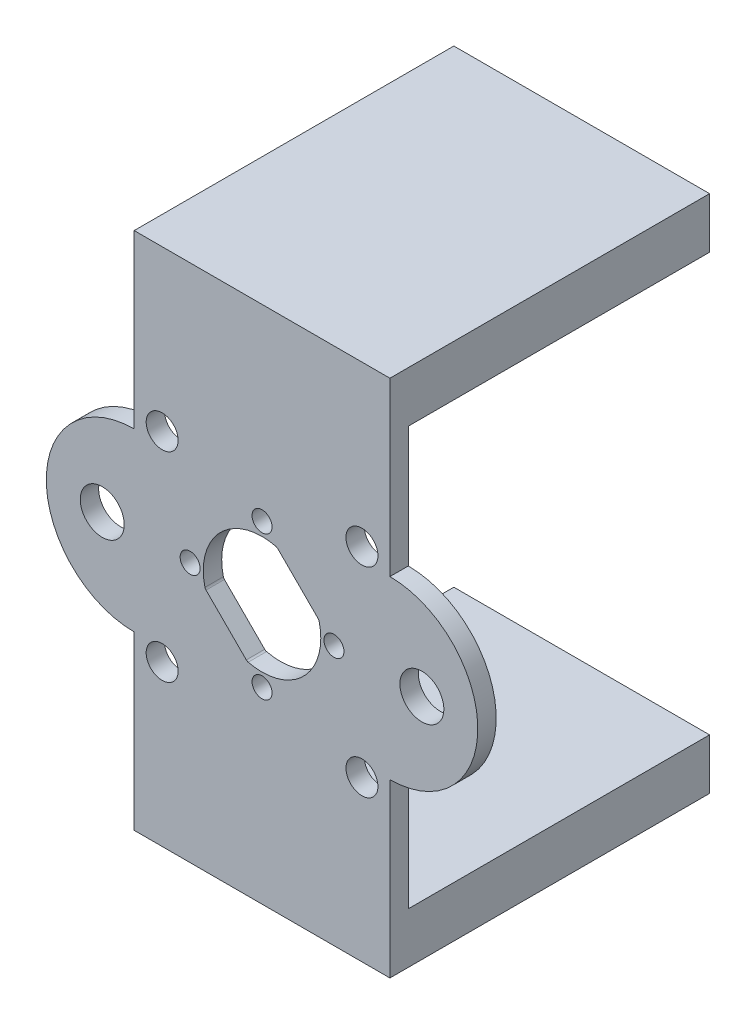
ISO-10303-21;
HEADER;
FILE_DESCRIPTION(('STEP AP214'),'2;1');
FILE_NAME('part.step','',(''),(''),'','','');
FILE_SCHEMA(('AUTOMOTIVE_DESIGN { 1 0 10303 214 1 1 1 1 }'));
ENDSEC;
DATA;
#1=APPLICATION_CONTEXT('core data for automotive mechanical design processes');
#2=APPLICATION_PROTOCOL_DEFINITION('international standard','automotive_design',2000,#1);
#3=PRODUCT_CONTEXT('',#1,'mechanical');
#4=PRODUCT('Part','Part','',(#3));
#5=PRODUCT_RELATED_PRODUCT_CATEGORY('part','',(#4));
#6=PRODUCT_DEFINITION_FORMATION('','',#4);
#7=PRODUCT_DEFINITION_CONTEXT('part definition',#1,'design');
#8=PRODUCT_DEFINITION('design','',#6,#7);
#9=PRODUCT_DEFINITION_SHAPE('','',#8);
#10=(LENGTH_UNIT() NAMED_UNIT(*) SI_UNIT(.MILLI.,.METRE.));
#11=(NAMED_UNIT(*) PLANE_ANGLE_UNIT() SI_UNIT($,.RADIAN.));
#12=(NAMED_UNIT(*) SI_UNIT($,.STERADIAN.) SOLID_ANGLE_UNIT());
#13=UNCERTAINTY_MEASURE_WITH_UNIT(LENGTH_MEASURE(1.E-05),#10,'distance_accuracy_value','');
#14=(GEOMETRIC_REPRESENTATION_CONTEXT(3) GLOBAL_UNCERTAINTY_ASSIGNED_CONTEXT((#13)) GLOBAL_UNIT_ASSIGNED_CONTEXT((#10,
#11,#12)) REPRESENTATION_CONTEXT('',''));
#15=CARTESIAN_POINT('',(0.,0.,0.));
#16=DIRECTION('',(0.,0.,1.));
#17=DIRECTION('',(1.,0.,0.));
#18=AXIS2_PLACEMENT_3D('',#15,#16,#17);
#19=CARTESIAN_POINT('',(16.,-32.5,-40.));
#20=DIRECTION('',(1.,0.,0.));
#21=DIRECTION('',(0.,0.,-1.));
#22=AXIS2_PLACEMENT_3D('',#19,#20,#21);
#23=PLANE('',#22);
#24=DIRECTION('',(0.,0.,1.));
#25=VECTOR('',#24,1.);
#26=CARTESIAN_POINT('',(16.,32.5,-40.));
#27=LINE('',#26,#25);
#28=CARTESIAN_POINT('',(16.,32.5,-40.));
#29=VERTEX_POINT('',#28);
#30=CARTESIAN_POINT('',(16.,32.5,0.));
#31=VERTEX_POINT('',#30);
#32=EDGE_CURVE('E48',#29,#31,#27,.T.);
#33=ORIENTED_EDGE('',*,*,#32,.T.);
#34=DIRECTION('',(0.,1.,0.));
#35=VECTOR('',#34,1.);
#36=CARTESIAN_POINT('',(16.,-32.5,0.));
#37=LINE('',#36,#35);
#38=CARTESIAN_POINT('',(16.,11.,0.));
#39=VERTEX_POINT('',#38);
#40=EDGE_CURVE('E346',#39,#31,#37,.T.);
#41=ORIENTED_EDGE('',*,*,#40,.F.);
#42=DIRECTION('',(0.,0.,1.));
#43=VECTOR('',#42,1.);
#44=CARTESIAN_POINT('',(16.,11.,-2.3));
#45=LINE('',#44,#43);
#46=CARTESIAN_POINT('',(16.,11.,-2.3));
#47=VERTEX_POINT('',#46);
#48=EDGE_CURVE('E313',#47,#39,#45,.T.);
#49=ORIENTED_EDGE('',*,*,#48,.F.);
#50=DIRECTION('',(0.,-1.,0.));
#51=VECTOR('',#50,1.);
#52=CARTESIAN_POINT('',(16.,-26.15,-2.3));
#53=LINE('',#52,#51);
#54=CARTESIAN_POINT('',(16.,26.15,-2.3));
#55=VERTEX_POINT('',#54);
#56=EDGE_CURVE('E333',#55,#47,#53,.T.);
#57=ORIENTED_EDGE('',*,*,#56,.F.);
#58=DIRECTION('',(0.,0.,-1.));
#59=VECTOR('',#58,1.);
#60=CARTESIAN_POINT('',(16.,26.15,-2.3));
#61=LINE('',#60,#59);
#62=CARTESIAN_POINT('',(16.,26.15,-40.));
#63=VERTEX_POINT('',#62);
#64=EDGE_CURVE('E349',#55,#63,#61,.T.);
#65=ORIENTED_EDGE('',*,*,#64,.T.);
#66=DIRECTION('',(0.,1.,0.));
#67=VECTOR('',#66,1.);
#68=CARTESIAN_POINT('',(16.,-32.5,-40.));
#69=LINE('',#68,#67);
#70=EDGE_CURVE('E357',#63,#29,#69,.T.);
#71=ORIENTED_EDGE('',*,*,#70,.T.);
#72=EDGE_LOOP('',(#33,#41,#49,#57,#65,#71));
#73=FACE_BOUND('',#72,.T.);
#74=ADVANCED_FACE('F44',(#73),#23,.T.);
#75=CARTESIAN_POINT('',(-16.,-32.5,-40.));
#76=DIRECTION('',(-1.,0.,0.));
#77=DIRECTION('',(0.,0.,1.));
#78=AXIS2_PLACEMENT_3D('',#75,#76,#77);
#79=PLANE('',#78);
#80=DIRECTION('',(0.,0.,1.));
#81=VECTOR('',#80,1.);
#82=CARTESIAN_POINT('',(-16.,-32.5,-40.));
#83=LINE('',#82,#81);
#84=CARTESIAN_POINT('',(-16.,-32.5,-40.));
#85=VERTEX_POINT('',#84);
#86=CARTESIAN_POINT('',(-16.,-32.5,0.));
#87=VERTEX_POINT('',#86);
#88=EDGE_CURVE('E53',#85,#87,#83,.T.);
#89=ORIENTED_EDGE('',*,*,#88,.T.);
#90=DIRECTION('',(0.,-1.,0.));
#91=VECTOR('',#90,1.);
#92=CARTESIAN_POINT('',(-16.,-32.5,0.));
#93=LINE('',#92,#91);
#94=CARTESIAN_POINT('',(-16.,-11.,0.));
#95=VERTEX_POINT('',#94);
#96=EDGE_CURVE('E373',#95,#87,#93,.T.);
#97=ORIENTED_EDGE('',*,*,#96,.F.);
#98=DIRECTION('',(0.,0.,1.));
#99=VECTOR('',#98,1.);
#100=CARTESIAN_POINT('',(-16.,-11.,-2.3));
#101=LINE('',#100,#99);
#102=CARTESIAN_POINT('',(-16.,-11.,-2.3));
#103=VERTEX_POINT('',#102);
#104=EDGE_CURVE('E320',#103,#95,#101,.T.);
#105=ORIENTED_EDGE('',*,*,#104,.F.);
#106=DIRECTION('',(0.,1.,0.));
#107=VECTOR('',#106,1.);
#108=CARTESIAN_POINT('',(-16.,-26.15,-2.3));
#109=LINE('',#108,#107);
#110=CARTESIAN_POINT('',(-16.,-26.15,-2.3));
#111=VERTEX_POINT('',#110);
#112=EDGE_CURVE('E325',#111,#103,#109,.T.);
#113=ORIENTED_EDGE('',*,*,#112,.F.);
#114=DIRECTION('',(0.,0.,-1.));
#115=VECTOR('',#114,1.);
#116=CARTESIAN_POINT('',(-16.,-26.15,-2.3));
#117=LINE('',#116,#115);
#118=CARTESIAN_POINT('',(-16.,-26.15,-40.));
#119=VERTEX_POINT('',#118);
#120=EDGE_CURVE('E343',#111,#119,#117,.T.);
#121=ORIENTED_EDGE('',*,*,#120,.T.);
#122=DIRECTION('',(0.,-1.,0.));
#123=VECTOR('',#122,1.);
#124=CARTESIAN_POINT('',(-16.,-32.5,-40.));
#125=LINE('',#124,#123);
#126=EDGE_CURVE('E360',#119,#85,#125,.T.);
#127=ORIENTED_EDGE('',*,*,#126,.T.);
#128=EDGE_LOOP('',(#89,#97,#105,#113,#121,#127));
#129=FACE_BOUND('',#128,.T.);
#130=ADVANCED_FACE('F408',(#129),#79,.T.);
#131=CARTESIAN_POINT('',(0.,0.,-40.));
#132=DIRECTION('',(0.,0.,-1.));
#133=DIRECTION('',(-1.,0.,0.));
#134=AXIS2_PLACEMENT_3D('',#131,#132,#133);
#135=PLANE('',#134);
#136=DIRECTION('',(-1.,0.,0.));
#137=VECTOR('',#136,1.);
#138=CARTESIAN_POINT('',(16.,-26.15,-40.));
#139=LINE('',#138,#137);
#140=CARTESIAN_POINT('',(16.,-26.15,-40.));
#141=VERTEX_POINT('',#140);
#142=EDGE_CURVE('E341',#141,#119,#139,.T.);
#143=ORIENTED_EDGE('',*,*,#142,.F.);
#144=CARTESIAN_POINT('',(16.,-32.5,-40.));
#145=VERTEX_POINT('',#144);
#146=EDGE_CURVE('E353',#145,#141,#69,.T.);
#147=ORIENTED_EDGE('',*,*,#146,.F.);
#148=DIRECTION('',(1.,0.,0.));
#149=VECTOR('',#148,1.);
#150=CARTESIAN_POINT('',(-16.,-32.5,-40.));
#151=LINE('',#150,#149);
#152=EDGE_CURVE('E364',#85,#145,#151,.T.);
#153=ORIENTED_EDGE('',*,*,#152,.F.);
#154=ORIENTED_EDGE('',*,*,#126,.F.);
#155=EDGE_LOOP('',(#143,#147,#153,#154));
#156=FACE_BOUND('',#155,.T.);
#157=ADVANCED_FACE('F404',(#156),#135,.T.);
#158=DIRECTION('',(0.,0.,1.));
#159=VECTOR('',#158,1.);
#160=CARTESIAN_POINT('',(16.,-11.,-2.3));
#161=LINE('',#160,#159);
#162=CARTESIAN_POINT('',(16.,-11.,-2.3));
#163=VERTEX_POINT('',#162);
#164=CARTESIAN_POINT('',(16.,-11.,0.));
#165=VERTEX_POINT('',#164);
#166=EDGE_CURVE('E317',#163,#165,#161,.T.);
#167=ORIENTED_EDGE('',*,*,#166,.T.);
#168=CARTESIAN_POINT('',(16.,-32.5,0.));
#169=VERTEX_POINT('',#168);
#170=EDGE_CURVE('E367',#169,#165,#37,.T.);
#171=ORIENTED_EDGE('',*,*,#170,.F.);
#172=DIRECTION('',(0.,0.,1.));
#173=VECTOR('',#172,1.);
#174=CARTESIAN_POINT('',(16.,-32.5,-40.));
#175=LINE('',#174,#173);
#176=EDGE_CURVE('E11',#145,#169,#175,.T.);
#177=ORIENTED_EDGE('',*,*,#176,.F.);
#178=ORIENTED_EDGE('',*,*,#146,.T.);
#179=DIRECTION('',(0.,0.,-1.));
#180=VECTOR('',#179,1.);
#181=CARTESIAN_POINT('',(16.,-26.15,-2.3));
#182=LINE('',#181,#180);
#183=CARTESIAN_POINT('',(16.,-26.15,-2.3));
#184=VERTEX_POINT('',#183);
#185=EDGE_CURVE('E347',#184,#141,#182,.T.);
#186=ORIENTED_EDGE('',*,*,#185,.F.);
#187=EDGE_CURVE('E332',#163,#184,#53,.T.);
#188=ORIENTED_EDGE('',*,*,#187,.F.);
#189=EDGE_LOOP('',(#167,#171,#177,#178,#186,#188));
#190=FACE_BOUND('',#189,.T.);
#191=ADVANCED_FACE('F46',(#190),#23,.T.);
#192=CARTESIAN_POINT('',(-16.,-32.5,-40.));
#193=DIRECTION('',(0.,-1.,0.));
#194=DIRECTION('',(0.,0.,-1.));
#195=AXIS2_PLACEMENT_3D('',#192,#193,#194);
#196=PLANE('',#195);
#197=DIRECTION('',(1.,0.,0.));
#198=VECTOR('',#197,1.);
#199=CARTESIAN_POINT('',(-16.,-32.5,0.));
#200=LINE('',#199,#198);
#201=EDGE_CURVE('E377',#87,#169,#200,.T.);
#202=ORIENTED_EDGE('',*,*,#201,.F.);
#203=ORIENTED_EDGE('',*,*,#88,.F.);
#204=ORIENTED_EDGE('',*,*,#152,.T.);
#205=ORIENTED_EDGE('',*,*,#176,.T.);
#206=EDGE_LOOP('',(#202,#203,#204,#205));
#207=FACE_BOUND('',#206,.T.);
#208=ADVANCED_FACE('F405',(#207),#196,.T.);
#209=DIRECTION('',(0.,0.,1.));
#210=VECTOR('',#209,1.);
#211=CARTESIAN_POINT('',(-16.,11.,-2.3));
#212=LINE('',#211,#210);
#213=CARTESIAN_POINT('',(-16.,11.,-2.3));
#214=VERTEX_POINT('',#213);
#215=CARTESIAN_POINT('',(-16.,11.,0.));
#216=VERTEX_POINT('',#215);
#217=EDGE_CURVE('E308',#214,#216,#212,.T.);
#218=ORIENTED_EDGE('',*,*,#217,.T.);
#219=CARTESIAN_POINT('',(-16.,32.5,0.));
#220=VERTEX_POINT('',#219);
#221=EDGE_CURVE('E374',#220,#216,#93,.T.);
#222=ORIENTED_EDGE('',*,*,#221,.F.);
#223=DIRECTION('',(0.,0.,1.));
#224=VECTOR('',#223,1.);
#225=CARTESIAN_POINT('',(-16.,32.5,-40.));
#226=LINE('',#225,#224);
#227=CARTESIAN_POINT('',(-16.,32.5,-40.));
#228=VERTEX_POINT('',#227);
#229=EDGE_CURVE('E380',#228,#220,#226,.T.);
#230=ORIENTED_EDGE('',*,*,#229,.F.);
#231=CARTESIAN_POINT('',(-16.,26.15,-40.));
#232=VERTEX_POINT('',#231);
#233=EDGE_CURVE('E361',#228,#232,#125,.T.);
#234=ORIENTED_EDGE('',*,*,#233,.T.);
#235=DIRECTION('',(0.,0.,-1.));
#236=VECTOR('',#235,1.);
#237=CARTESIAN_POINT('',(-16.,26.15,-2.3));
#238=LINE('',#237,#236);
#239=CARTESIAN_POINT('',(-16.,26.15,-2.3));
#240=VERTEX_POINT('',#239);
#241=EDGE_CURVE('E339',#240,#232,#238,.T.);
#242=ORIENTED_EDGE('',*,*,#241,.F.);
#243=EDGE_CURVE('E329',#214,#240,#109,.T.);
#244=ORIENTED_EDGE('',*,*,#243,.F.);
#245=EDGE_LOOP('',(#218,#222,#230,#234,#242,#244));
#246=FACE_BOUND('',#245,.T.);
#247=ADVANCED_FACE('F396',(#246),#79,.T.);
#248=CARTESIAN_POINT('',(-16.,32.5,-40.));
#249=DIRECTION('',(0.,1.,0.));
#250=DIRECTION('',(0.,0.,1.));
#251=AXIS2_PLACEMENT_3D('',#248,#249,#250);
#252=PLANE('',#251);
#253=DIRECTION('',(-1.,0.,0.));
#254=VECTOR('',#253,1.);
#255=CARTESIAN_POINT('',(-16.,32.5,0.));
#256=LINE('',#255,#254);
#257=EDGE_CURVE('E370',#31,#220,#256,.T.);
#258=ORIENTED_EDGE('',*,*,#257,.F.);
#259=ORIENTED_EDGE('',*,*,#32,.F.);
#260=DIRECTION('',(-1.,0.,0.));
#261=VECTOR('',#260,1.);
#262=CARTESIAN_POINT('',(-16.,32.5,-40.));
#263=LINE('',#262,#261);
#264=EDGE_CURVE('E356',#29,#228,#263,.T.);
#265=ORIENTED_EDGE('',*,*,#264,.T.);
#266=ORIENTED_EDGE('',*,*,#229,.T.);
#267=EDGE_LOOP('',(#258,#259,#265,#266));
#268=FACE_BOUND('',#267,.T.);
#269=ADVANCED_FACE('F393',(#268),#252,.T.);
#270=DIRECTION('',(1.,0.,0.));
#271=VECTOR('',#270,1.);
#272=CARTESIAN_POINT('',(16.,26.15,-40.));
#273=LINE('',#272,#271);
#274=EDGE_CURVE('E316',#232,#63,#273,.T.);
#275=ORIENTED_EDGE('',*,*,#274,.F.);
#276=ORIENTED_EDGE('',*,*,#233,.F.);
#277=ORIENTED_EDGE('',*,*,#264,.F.);
#278=ORIENTED_EDGE('',*,*,#70,.F.);
#279=EDGE_LOOP('',(#275,#276,#277,#278));
#280=FACE_BOUND('',#279,.T.);
#281=ADVANCED_FACE('F395',(#280),#135,.T.);
#282=CARTESIAN_POINT('',(0.,0.,0.));
#283=DIRECTION('',(0.,0.,-1.));
#284=DIRECTION('',(-1.,0.,0.));
#285=AXIS2_PLACEMENT_3D('',#282,#283,#284);
#286=PLANE('',#285);
#287=CARTESIAN_POINT('',(-20.,0.,0.));
#288=DIRECTION('',(0.,0.,1.));
#289=DIRECTION('',(1.,0.,0.));
#290=AXIS2_PLACEMENT_3D('',#287,#288,#289);
#291=CIRCLE('',#290,2.75);
#292=CARTESIAN_POINT('',(-17.25,0.,0.));
#293=VERTEX_POINT('',#292);
#294=EDGE_CURVE('E294',#293,#293,#291,.T.);
#295=ORIENTED_EDGE('',*,*,#294,.F.);
#296=EDGE_LOOP('',(#295));
#297=FACE_BOUND('',#296,.T.);
#298=CARTESIAN_POINT('',(6.65649530361211,1.6166540362705,0.));
#299=DIRECTION('',(0.,0.,1.));
#300=DIRECTION('',(1.,0.,0.));
#301=AXIS2_PLACEMENT_3D('',#298,#299,#300);
#302=CIRCLE('',#301,0.499999999999998);
#303=CARTESIAN_POINT('',(7.14237087321884,1.73465798052379,0.));
#304=VERTEX_POINT('',#303);
#305=CARTESIAN_POINT('',(7.01004869420541,1.97020742686375,0.));
#306=VERTEX_POINT('',#305);
#307=EDGE_CURVE('E224',#304,#306,#302,.T.);
#308=ORIENTED_EDGE('',*,*,#307,.F.);
#309=CARTESIAN_POINT('',(0.,0.,0.));
#310=DIRECTION('',(0.,0.,1.));
#311=DIRECTION('',(1.,0.,0.));
#312=AXIS2_PLACEMENT_3D('',#309,#310,#311);
#313=CIRCLE('',#312,7.34999999999999);
#314=CARTESIAN_POINT('',(-1.7346579805238,-7.14237087321884,0.));
#315=VERTEX_POINT('',#314);
#316=EDGE_CURVE('E61',#315,#304,#313,.T.);
#317=ORIENTED_EDGE('',*,*,#316,.F.);
#318=CARTESIAN_POINT('',(-1.61665403627048,-6.65649530361213,0.));
#319=DIRECTION('',(0.,0.,1.));
#320=DIRECTION('',(1.,0.,0.));
#321=AXIS2_PLACEMENT_3D('',#318,#319,#320);
#322=CIRCLE('',#321,0.499999999999984);
#323=CARTESIAN_POINT('',(-1.97020742686374,-7.0100486942054,0.));
#324=VERTEX_POINT('',#323);
#325=EDGE_CURVE('E201',#324,#315,#322,.T.);
#326=ORIENTED_EDGE('',*,*,#325,.F.);
#327=DIRECTION('',(0.707106781186548,-0.707106781186548,0.));
#328=VECTOR('',#327,1.);
#329=CARTESIAN_POINT('',(-4.49012806053457,-4.49012806053457,0.));
#330=LINE('',#329,#328);
#331=CARTESIAN_POINT('',(-7.01004869420541,-1.97020742686372,0.));
#332=VERTEX_POINT('',#331);
#333=EDGE_CURVE('E204',#332,#324,#330,.T.);
#334=ORIENTED_EDGE('',*,*,#333,.F.);
#335=CARTESIAN_POINT('',(-6.65649530361214,-1.61665403627048,0.));
#336=DIRECTION('',(0.,0.,1.));
#337=DIRECTION('',(1.,0.,0.));
#338=AXIS2_PLACEMENT_3D('',#335,#336,#337);
#339=CIRCLE('',#338,0.499999999999977);
#340=CARTESIAN_POINT('',(-7.14237087321884,-1.7346579805238,0.));
#341=VERTEX_POINT('',#340);
#342=EDGE_CURVE('E235',#341,#332,#339,.T.);
#343=ORIENTED_EDGE('',*,*,#342,.F.);
#344=CARTESIAN_POINT('',(0.,0.,0.));
#345=DIRECTION('',(0.,0.,1.));
#346=DIRECTION('',(1.,0.,0.));
#347=AXIS2_PLACEMENT_3D('',#344,#345,#346);
#348=CIRCLE('',#347,7.34999999999999);
#349=CARTESIAN_POINT('',(1.73465798052379,7.14237087321884,0.));
#350=VERTEX_POINT('',#349);
#351=EDGE_CURVE('E232',#350,#341,#348,.T.);
#352=ORIENTED_EDGE('',*,*,#351,.F.);
#353=DIRECTION('',(-0.871851203413506,0.489770843462962,0.));
#354=VECTOR('',#353,1.);
#355=CARTESIAN_POINT('',(3.46594641112203,6.1698028574704,0.));
#356=LINE('',#355,#354);
#357=CARTESIAN_POINT('',(1.97020742686375,7.01004869420542,0.));
#358=VERTEX_POINT('',#357);
#359=EDGE_CURVE('E229',#358,#350,#356,.T.);
#360=ORIENTED_EDGE('',*,*,#359,.F.);
#361=DIRECTION('',(-0.707106781186547,0.707106781186548,0.));
#362=VECTOR('',#361,1.);
#363=CARTESIAN_POINT('',(4.49012806053458,4.49012806053458,0.));
#364=LINE('',#363,#362);
#365=EDGE_CURVE('E226',#306,#358,#364,.T.);
#366=ORIENTED_EDGE('',*,*,#365,.F.);
#367=EDGE_LOOP('',(#308,#317,#326,#334,#343,#352,#360,#366));
#368=FACE_BOUND('',#367,.T.);
#369=CARTESIAN_POINT('',(12.5,-12.5,0.));
#370=DIRECTION('',(0.,0.,1.));
#371=DIRECTION('',(1.,0.,0.));
#372=AXIS2_PLACEMENT_3D('',#369,#370,#371);
#373=CIRCLE('',#372,2.00000000000001);
#374=CARTESIAN_POINT('',(14.5,-12.5,0.));
#375=VERTEX_POINT('',#374);
#376=EDGE_CURVE('E207',#375,#375,#373,.T.);
#377=ORIENTED_EDGE('',*,*,#376,.F.);
#378=EDGE_LOOP('',(#377));
#379=FACE_BOUND('',#378,.T.);
#380=CARTESIAN_POINT('',(0.,-9.00000013411044,0.));
#381=DIRECTION('',(0.,0.,1.));
#382=DIRECTION('',(1.,0.,0.));
#383=AXIS2_PLACEMENT_3D('',#380,#381,#382);
#384=CIRCLE('',#383,1.24999999999998);
#385=CARTESIAN_POINT('',(1.24999999999999,-9.00000013411044,0.));
#386=VERTEX_POINT('',#385);
#387=EDGE_CURVE('E270',#386,#386,#384,.T.);
#388=ORIENTED_EDGE('',*,*,#387,.F.);
#389=EDGE_LOOP('',(#388));
#390=FACE_BOUND('',#389,.T.);
#391=CARTESIAN_POINT('',(9.00000013411045,0.,0.));
#392=DIRECTION('',(0.,0.,1.));
#393=DIRECTION('',(1.,0.,0.));
#394=AXIS2_PLACEMENT_3D('',#391,#392,#393);
#395=CIRCLE('',#394,1.25);
#396=CARTESIAN_POINT('',(10.2500001341104,0.,0.));
#397=VERTEX_POINT('',#396);
#398=EDGE_CURVE('E283',#397,#397,#395,.T.);
#399=ORIENTED_EDGE('',*,*,#398,.F.);
#400=EDGE_LOOP('',(#399));
#401=FACE_BOUND('',#400,.T.);
#402=CARTESIAN_POINT('',(-12.5,12.4999999999999,0.));
#403=DIRECTION('',(0.,0.,1.));
#404=DIRECTION('',(1.,0.,0.));
#405=AXIS2_PLACEMENT_3D('',#402,#403,#404);
#406=CIRCLE('',#405,2.00000000000016);
#407=CARTESIAN_POINT('',(-10.4999999999998,12.4999999999999,0.));
#408=VERTEX_POINT('',#407);
#409=EDGE_CURVE('E282',#408,#408,#406,.T.);
#410=ORIENTED_EDGE('',*,*,#409,.F.);
#411=EDGE_LOOP('',(#410));
#412=FACE_BOUND('',#411,.T.);
#413=CARTESIAN_POINT('',(20.,0.,0.));
#414=DIRECTION('',(0.,0.,1.));
#415=DIRECTION('',(1.,0.,0.));
#416=AXIS2_PLACEMENT_3D('',#413,#414,#415);
#417=CIRCLE('',#416,2.75);
#418=CARTESIAN_POINT('',(22.75,0.,0.));
#419=VERTEX_POINT('',#418);
#420=EDGE_CURVE('E295',#419,#419,#417,.T.);
#421=ORIENTED_EDGE('',*,*,#420,.F.);
#422=EDGE_LOOP('',(#421));
#423=FACE_BOUND('',#422,.T.);
#424=CARTESIAN_POINT('',(-12.5,-12.5,0.));
#425=DIRECTION('',(0.,0.,1.));
#426=DIRECTION('',(1.,0.,0.));
#427=AXIS2_PLACEMENT_3D('',#424,#425,#426);
#428=CIRCLE('',#427,2.);
#429=CARTESIAN_POINT('',(-10.5,-12.5,0.));
#430=VERTEX_POINT('',#429);
#431=EDGE_CURVE('E263',#430,#430,#428,.T.);
#432=ORIENTED_EDGE('',*,*,#431,.F.);
#433=EDGE_LOOP('',(#432));
#434=FACE_BOUND('',#433,.T.);
#435=CARTESIAN_POINT('',(12.5,12.4999999999999,0.));
#436=DIRECTION('',(0.,0.,1.));
#437=DIRECTION('',(1.,0.,0.));
#438=AXIS2_PLACEMENT_3D('',#435,#436,#437);
#439=CIRCLE('',#438,2.00000000000015);
#440=CARTESIAN_POINT('',(14.5000000000002,12.4999999999999,0.));
#441=VERTEX_POINT('',#440);
#442=EDGE_CURVE('E257',#441,#441,#439,.T.);
#443=ORIENTED_EDGE('',*,*,#442,.F.);
#444=EDGE_LOOP('',(#443));
#445=FACE_BOUND('',#444,.T.);
#446=CARTESIAN_POINT('',(0.,9.00000013411045,0.));
#447=DIRECTION('',(0.,0.,1.));
#448=DIRECTION('',(1.,0.,0.));
#449=AXIS2_PLACEMENT_3D('',#446,#447,#448);
#450=CIRCLE('',#449,1.25000000000009);
#451=CARTESIAN_POINT('',(1.25000000000009,9.00000013411045,0.));
#452=VERTEX_POINT('',#451);
#453=EDGE_CURVE('E256',#452,#452,#450,.T.);
#454=ORIENTED_EDGE('',*,*,#453,.F.);
#455=EDGE_LOOP('',(#454));
#456=FACE_BOUND('',#455,.T.);
#457=CARTESIAN_POINT('',(-9.00000013411045,0.,0.));
#458=DIRECTION('',(0.,0.,1.));
#459=DIRECTION('',(1.,0.,0.));
#460=AXIS2_PLACEMENT_3D('',#457,#458,#459);
#461=CIRCLE('',#460,1.25);
#462=CARTESIAN_POINT('',(-7.75000013411044,0.,0.));
#463=VERTEX_POINT('',#462);
#464=EDGE_CURVE('E271',#463,#463,#461,.T.);
#465=ORIENTED_EDGE('',*,*,#464,.F.);
#466=EDGE_LOOP('',(#465));
#467=FACE_BOUND('',#466,.T.);
#468=ORIENTED_EDGE('',*,*,#170,.T.);
#469=CARTESIAN_POINT('',(16.,0.,0.));
#470=DIRECTION('',(0.,0.,1.));
#471=DIRECTION('',(1.,0.,0.));
#472=AXIS2_PLACEMENT_3D('',#469,#470,#471);
#473=CIRCLE('',#472,11.);
#474=EDGE_CURVE('E306',#165,#39,#473,.T.);
#475=ORIENTED_EDGE('',*,*,#474,.T.);
#476=ORIENTED_EDGE('',*,*,#40,.T.);
#477=ORIENTED_EDGE('',*,*,#257,.T.);
#478=ORIENTED_EDGE('',*,*,#221,.T.);
#479=CARTESIAN_POINT('',(-16.,0.,0.));
#480=DIRECTION('',(0.,0.,1.));
#481=DIRECTION('',(1.,0.,0.));
#482=AXIS2_PLACEMENT_3D('',#479,#480,#481);
#483=CIRCLE('',#482,11.);
#484=EDGE_CURVE('E309',#216,#95,#483,.T.);
#485=ORIENTED_EDGE('',*,*,#484,.T.);
#486=ORIENTED_EDGE('',*,*,#96,.T.);
#487=ORIENTED_EDGE('',*,*,#201,.T.);
#488=EDGE_LOOP('',(#468,#475,#476,#477,#478,#485,#486,#487));
#489=FACE_BOUND('',#488,.T.);
#490=ADVANCED_FACE('F392',(#297,#368,#379,#390,#401,#412,#423,#434,#445,#456,#467,#489),#286,.F.);
#491=CARTESIAN_POINT('',(16.,-26.15,-2.3));
#492=DIRECTION('',(0.,-1.,0.));
#493=DIRECTION('',(0.,0.,-1.));
#494=AXIS2_PLACEMENT_3D('',#491,#492,#493);
#495=PLANE('',#494);
#496=ORIENTED_EDGE('',*,*,#142,.T.);
#497=ORIENTED_EDGE('',*,*,#120,.F.);
#498=DIRECTION('',(-1.,0.,0.));
#499=VECTOR('',#498,1.);
#500=CARTESIAN_POINT('',(16.,-26.15,-2.3));
#501=LINE('',#500,#499);
#502=EDGE_CURVE('E336',#184,#111,#501,.T.);
#503=ORIENTED_EDGE('',*,*,#502,.F.);
#504=ORIENTED_EDGE('',*,*,#185,.T.);
#505=EDGE_LOOP('',(#496,#497,#503,#504));
#506=FACE_BOUND('',#505,.T.);
#507=ADVANCED_FACE('F438',(#506),#495,.F.);
#508=CARTESIAN_POINT('',(16.,26.15,-2.3));
#509=DIRECTION('',(0.,1.,0.));
#510=DIRECTION('',(0.,0.,1.));
#511=AXIS2_PLACEMENT_3D('',#508,#509,#510);
#512=PLANE('',#511);
#513=ORIENTED_EDGE('',*,*,#274,.T.);
#514=ORIENTED_EDGE('',*,*,#64,.F.);
#515=DIRECTION('',(1.,0.,0.));
#516=VECTOR('',#515,1.);
#517=CARTESIAN_POINT('',(16.,26.15,-2.3));
#518=LINE('',#517,#516);
#519=EDGE_CURVE('E328',#240,#55,#518,.T.);
#520=ORIENTED_EDGE('',*,*,#519,.F.);
#521=ORIENTED_EDGE('',*,*,#241,.T.);
#522=EDGE_LOOP('',(#513,#514,#520,#521));
#523=FACE_BOUND('',#522,.T.);
#524=ADVANCED_FACE('F461',(#523),#512,.F.);
#525=CARTESIAN_POINT('',(0.,0.,-2.3));
#526=DIRECTION('',(0.,0.,1.));
#527=DIRECTION('',(1.,0.,0.));
#528=AXIS2_PLACEMENT_3D('',#525,#526,#527);
#529=PLANE('',#528);
#530=CARTESIAN_POINT('',(-20.,0.,-2.3));
#531=DIRECTION('',(0.,0.,1.));
#532=DIRECTION('',(1.,0.,0.));
#533=AXIS2_PLACEMENT_3D('',#530,#531,#532);
#534=CIRCLE('',#533,2.75);
#535=CARTESIAN_POINT('',(-17.25,0.,-2.3));
#536=VERTEX_POINT('',#535);
#537=EDGE_CURVE('E311',#536,#536,#534,.T.);
#538=ORIENTED_EDGE('',*,*,#537,.T.);
#539=EDGE_LOOP('',(#538));
#540=FACE_BOUND('',#539,.T.);
#541=CARTESIAN_POINT('',(-1.61665403627048,-6.65649530361213,-2.3));
#542=DIRECTION('',(0.,0.,1.));
#543=DIRECTION('',(1.,0.,0.));
#544=AXIS2_PLACEMENT_3D('',#541,#542,#543);
#545=CIRCLE('',#544,0.499999999999984);
#546=CARTESIAN_POINT('',(-1.97020742686374,-7.0100486942054,-2.3));
#547=VERTEX_POINT('',#546);
#548=CARTESIAN_POINT('',(-1.7346579805238,-7.14237087321884,-2.3));
#549=VERTEX_POINT('',#548);
#550=EDGE_CURVE('E190',#547,#549,#545,.T.);
#551=ORIENTED_EDGE('',*,*,#550,.T.);
#552=CARTESIAN_POINT('',(0.,0.,-2.3));
#553=DIRECTION('',(0.,0.,1.));
#554=DIRECTION('',(1.,0.,0.));
#555=AXIS2_PLACEMENT_3D('',#552,#553,#554);
#556=CIRCLE('',#555,7.34999999999999);
#557=CARTESIAN_POINT('',(7.14237087321884,1.73465798052379,-2.3));
#558=VERTEX_POINT('',#557);
#559=EDGE_CURVE('E184',#549,#558,#556,.T.);
#560=ORIENTED_EDGE('',*,*,#559,.T.);
#561=CARTESIAN_POINT('',(6.65649530361211,1.6166540362705,-2.3));
#562=DIRECTION('',(0.,0.,1.));
#563=DIRECTION('',(1.,0.,0.));
#564=AXIS2_PLACEMENT_3D('',#561,#562,#563);
#565=CIRCLE('',#564,0.499999999999998);
#566=CARTESIAN_POINT('',(7.01004869420541,1.97020742686375,-2.3));
#567=VERTEX_POINT('',#566);
#568=EDGE_CURVE('E193',#558,#567,#565,.T.);
#569=ORIENTED_EDGE('',*,*,#568,.T.);
#570=DIRECTION('',(-0.707106781186547,0.707106781186548,0.));
#571=VECTOR('',#570,1.);
#572=CARTESIAN_POINT('',(4.49012806053458,4.49012806053458,-2.3));
#573=LINE('',#572,#571);
#574=CARTESIAN_POINT('',(1.97020742686375,7.01004869420542,-2.3));
#575=VERTEX_POINT('',#574);
#576=EDGE_CURVE('E69',#567,#575,#573,.T.);
#577=ORIENTED_EDGE('',*,*,#576,.T.);
#578=DIRECTION('',(-0.871851203413506,0.489770843462962,0.));
#579=VECTOR('',#578,1.);
#580=CARTESIAN_POINT('',(3.46594641112203,6.1698028574704,-2.3));
#581=LINE('',#580,#579);
#582=CARTESIAN_POINT('',(1.73465798052379,7.14237087321884,-2.3));
#583=VERTEX_POINT('',#582);
#584=EDGE_CURVE('E211',#575,#583,#581,.T.);
#585=ORIENTED_EDGE('',*,*,#584,.T.);
#586=CARTESIAN_POINT('',(0.,0.,-2.3));
#587=DIRECTION('',(0.,0.,1.));
#588=DIRECTION('',(1.,0.,0.));
#589=AXIS2_PLACEMENT_3D('',#586,#587,#588);
#590=CIRCLE('',#589,7.34999999999999);
#591=CARTESIAN_POINT('',(-7.14237087321884,-1.7346579805238,-2.3));
#592=VERTEX_POINT('',#591);
#593=EDGE_CURVE('E214',#583,#592,#590,.T.);
#594=ORIENTED_EDGE('',*,*,#593,.T.);
#595=CARTESIAN_POINT('',(-6.65649530361214,-1.61665403627048,-2.3));
#596=DIRECTION('',(0.,0.,1.));
#597=DIRECTION('',(1.,0.,0.));
#598=AXIS2_PLACEMENT_3D('',#595,#596,#597);
#599=CIRCLE('',#598,0.499999999999977);
#600=CARTESIAN_POINT('',(-7.01004869420541,-1.97020742686372,-2.3));
#601=VERTEX_POINT('',#600);
#602=EDGE_CURVE('E217',#592,#601,#599,.T.);
#603=ORIENTED_EDGE('',*,*,#602,.T.);
#604=DIRECTION('',(0.707106781186548,-0.707106781186548,0.));
#605=VECTOR('',#604,1.);
#606=CARTESIAN_POINT('',(-4.49012806053457,-4.49012806053457,-2.3));
#607=LINE('',#606,#605);
#608=EDGE_CURVE('E220',#601,#547,#607,.T.);
#609=ORIENTED_EDGE('',*,*,#608,.T.);
#610=EDGE_LOOP('',(#551,#560,#569,#577,#585,#594,#603,#609));
#611=FACE_BOUND('',#610,.T.);
#612=CARTESIAN_POINT('',(12.5,-12.5,-2.3));
#613=DIRECTION('',(0.,0.,1.));
#614=DIRECTION('',(1.,0.,0.));
#615=AXIS2_PLACEMENT_3D('',#612,#613,#614);
#616=CIRCLE('',#615,2.00000000000001);
#617=CARTESIAN_POINT('',(14.5,-12.5,-2.3));
#618=VERTEX_POINT('',#617);
#619=EDGE_CURVE('E266',#618,#618,#616,.T.);
#620=ORIENTED_EDGE('',*,*,#619,.T.);
#621=EDGE_LOOP('',(#620));
#622=FACE_BOUND('',#621,.T.);
#623=CARTESIAN_POINT('',(0.,-9.00000013411044,-2.3));
#624=DIRECTION('',(0.,0.,1.));
#625=DIRECTION('',(1.,0.,0.));
#626=AXIS2_PLACEMENT_3D('',#623,#624,#625);
#627=CIRCLE('',#626,1.24999999999998);
#628=CARTESIAN_POINT('',(1.24999999999999,-9.00000013411044,-2.3));
#629=VERTEX_POINT('',#628);
#630=EDGE_CURVE('E286',#629,#629,#627,.T.);
#631=ORIENTED_EDGE('',*,*,#630,.T.);
#632=EDGE_LOOP('',(#631));
#633=FACE_BOUND('',#632,.T.);
#634=CARTESIAN_POINT('',(9.00000013411045,0.,-2.3));
#635=DIRECTION('',(0.,0.,1.));
#636=DIRECTION('',(1.,0.,0.));
#637=AXIS2_PLACEMENT_3D('',#634,#635,#636);
#638=CIRCLE('',#637,1.25);
#639=CARTESIAN_POINT('',(10.2500001341104,0.,-2.3));
#640=VERTEX_POINT('',#639);
#641=EDGE_CURVE('E279',#640,#640,#638,.T.);
#642=ORIENTED_EDGE('',*,*,#641,.T.);
#643=EDGE_LOOP('',(#642));
#644=FACE_BOUND('',#643,.T.);
#645=CARTESIAN_POINT('',(-12.5,12.4999999999999,-2.3));
#646=DIRECTION('',(0.,0.,1.));
#647=DIRECTION('',(1.,0.,0.));
#648=AXIS2_PLACEMENT_3D('',#645,#646,#647);
#649=CIRCLE('',#648,2.00000000000016);
#650=CARTESIAN_POINT('',(-10.4999999999998,12.4999999999999,-2.3));
#651=VERTEX_POINT('',#650);
#652=EDGE_CURVE('E298',#651,#651,#649,.T.);
#653=ORIENTED_EDGE('',*,*,#652,.T.);
#654=EDGE_LOOP('',(#653));
#655=FACE_BOUND('',#654,.T.);
#656=CARTESIAN_POINT('',(20.,0.,-2.3));
#657=DIRECTION('',(0.,0.,1.));
#658=DIRECTION('',(1.,0.,0.));
#659=AXIS2_PLACEMENT_3D('',#656,#657,#658);
#660=CIRCLE('',#659,2.75);
#661=CARTESIAN_POINT('',(22.75,0.,-2.3));
#662=VERTEX_POINT('',#661);
#663=EDGE_CURVE('E291',#662,#662,#660,.T.);
#664=ORIENTED_EDGE('',*,*,#663,.T.);
#665=EDGE_LOOP('',(#664));
#666=FACE_BOUND('',#665,.T.);
#667=CARTESIAN_POINT('',(-12.5,-12.5,-2.3));
#668=DIRECTION('',(0.,0.,1.));
#669=DIRECTION('',(1.,0.,0.));
#670=AXIS2_PLACEMENT_3D('',#667,#668,#669);
#671=CIRCLE('',#670,2.);
#672=CARTESIAN_POINT('',(-10.5,-12.5,-2.3));
#673=VERTEX_POINT('',#672);
#674=EDGE_CURVE('E260',#673,#673,#671,.T.);
#675=ORIENTED_EDGE('',*,*,#674,.T.);
#676=EDGE_LOOP('',(#675));
#677=FACE_BOUND('',#676,.T.);
#678=CARTESIAN_POINT('',(12.5,12.4999999999999,-2.3));
#679=DIRECTION('',(0.,0.,1.));
#680=DIRECTION('',(1.,0.,0.));
#681=AXIS2_PLACEMENT_3D('',#678,#679,#680);
#682=CIRCLE('',#681,2.00000000000015);
#683=CARTESIAN_POINT('',(14.5000000000002,12.4999999999999,-2.3));
#684=VERTEX_POINT('',#683);
#685=EDGE_CURVE('E253',#684,#684,#682,.T.);
#686=ORIENTED_EDGE('',*,*,#685,.T.);
#687=EDGE_LOOP('',(#686));
#688=FACE_BOUND('',#687,.T.);
#689=CARTESIAN_POINT('',(0.,9.00000013411045,-2.3));
#690=DIRECTION('',(0.,0.,1.));
#691=DIRECTION('',(1.,0.,0.));
#692=AXIS2_PLACEMENT_3D('',#689,#690,#691);
#693=CIRCLE('',#692,1.25000000000009);
#694=CARTESIAN_POINT('',(1.25000000000009,9.00000013411045,-2.3));
#695=VERTEX_POINT('',#694);
#696=EDGE_CURVE('E274',#695,#695,#693,.T.);
#697=ORIENTED_EDGE('',*,*,#696,.T.);
#698=EDGE_LOOP('',(#697));
#699=FACE_BOUND('',#698,.T.);
#700=CARTESIAN_POINT('',(-9.00000013411045,0.,-2.3));
#701=DIRECTION('',(0.,0.,1.));
#702=DIRECTION('',(1.,0.,0.));
#703=AXIS2_PLACEMENT_3D('',#700,#701,#702);
#704=CIRCLE('',#703,1.25);
#705=CARTESIAN_POINT('',(-7.75000013411044,0.,-2.3));
#706=VERTEX_POINT('',#705);
#707=EDGE_CURVE('E267',#706,#706,#704,.T.);
#708=ORIENTED_EDGE('',*,*,#707,.T.);
#709=EDGE_LOOP('',(#708));
#710=FACE_BOUND('',#709,.T.);
#711=ORIENTED_EDGE('',*,*,#112,.T.);
#712=CARTESIAN_POINT('',(-16.,0.,-2.3));
#713=DIRECTION('',(0.,0.,1.));
#714=DIRECTION('',(1.,0.,0.));
#715=AXIS2_PLACEMENT_3D('',#712,#713,#714);
#716=CIRCLE('',#715,11.);
#717=EDGE_CURVE('E303',#214,#103,#716,.T.);
#718=ORIENTED_EDGE('',*,*,#717,.F.);
#719=ORIENTED_EDGE('',*,*,#243,.T.);
#720=ORIENTED_EDGE('',*,*,#519,.T.);
#721=ORIENTED_EDGE('',*,*,#56,.T.);
#722=CARTESIAN_POINT('',(16.,0.,-2.3));
#723=DIRECTION('',(0.,0.,1.));
#724=DIRECTION('',(1.,0.,0.));
#725=AXIS2_PLACEMENT_3D('',#722,#723,#724);
#726=CIRCLE('',#725,11.);
#727=EDGE_CURVE('E305',#163,#47,#726,.T.);
#728=ORIENTED_EDGE('',*,*,#727,.F.);
#729=ORIENTED_EDGE('',*,*,#187,.T.);
#730=ORIENTED_EDGE('',*,*,#502,.T.);
#731=EDGE_LOOP('',(#711,#718,#719,#720,#721,#728,#729,#730));
#732=FACE_BOUND('',#731,.T.);
#733=ADVANCED_FACE('F197',(#540,#611,#622,#633,#644,#655,#666,#677,#688,#699,#710,#732),#529,.F.);
#734=CARTESIAN_POINT('',(-16.,0.,-2.3));
#735=DIRECTION('',(0.,0.,1.));
#736=DIRECTION('',(1.,0.,0.));
#737=AXIS2_PLACEMENT_3D('',#734,#735,#736);
#738=CYLINDRICAL_SURFACE('',#737,11.);
#739=ORIENTED_EDGE('',*,*,#484,.F.);
#740=ORIENTED_EDGE('',*,*,#217,.F.);
#741=ORIENTED_EDGE('',*,*,#717,.T.);
#742=ORIENTED_EDGE('',*,*,#104,.T.);
#743=EDGE_LOOP('',(#739,#740,#741,#742));
#744=FACE_BOUND('',#743,.T.);
#745=ADVANCED_FACE('F453',(#744),#738,.T.);
#746=CARTESIAN_POINT('',(16.,0.,-2.3));
#747=DIRECTION('',(0.,0.,1.));
#748=DIRECTION('',(1.,0.,0.));
#749=AXIS2_PLACEMENT_3D('',#746,#747,#748);
#750=CYLINDRICAL_SURFACE('',#749,11.);
#751=ORIENTED_EDGE('',*,*,#474,.F.);
#752=ORIENTED_EDGE('',*,*,#166,.F.);
#753=ORIENTED_EDGE('',*,*,#727,.T.);
#754=ORIENTED_EDGE('',*,*,#48,.T.);
#755=EDGE_LOOP('',(#751,#752,#753,#754));
#756=FACE_BOUND('',#755,.T.);
#757=ADVANCED_FACE('F446',(#756),#750,.T.);
#758=CARTESIAN_POINT('',(-9.00000013411045,0.,-2.3));
#759=DIRECTION('',(0.,0.,1.));
#760=DIRECTION('',(1.,0.,0.));
#761=AXIS2_PLACEMENT_3D('',#758,#759,#760);
#762=CYLINDRICAL_SURFACE('',#761,1.25);
#763=ORIENTED_EDGE('',*,*,#707,.F.);
#764=EDGE_LOOP('',(#763));
#765=FACE_BOUND('',#764,.T.);
#766=ORIENTED_EDGE('',*,*,#464,.T.);
#767=EDGE_LOOP('',(#766));
#768=FACE_BOUND('',#767,.T.);
#769=ADVANCED_FACE('F458',(#765,#768),#762,.F.);
#770=CARTESIAN_POINT('',(0.,9.00000013411045,-2.3));
#771=DIRECTION('',(0.,0.,1.));
#772=DIRECTION('',(1.,0.,0.));
#773=AXIS2_PLACEMENT_3D('',#770,#771,#772);
#774=CYLINDRICAL_SURFACE('',#773,1.25000000000009);
#775=ORIENTED_EDGE('',*,*,#696,.F.);
#776=EDGE_LOOP('',(#775));
#777=FACE_BOUND('',#776,.T.);
#778=ORIENTED_EDGE('',*,*,#453,.T.);
#779=EDGE_LOOP('',(#778));
#780=FACE_BOUND('',#779,.T.);
#781=ADVANCED_FACE('F498',(#777,#780),#774,.F.);
#782=CARTESIAN_POINT('',(12.5,12.4999999999999,-2.3));
#783=DIRECTION('',(0.,0.,1.));
#784=DIRECTION('',(1.,0.,0.));
#785=AXIS2_PLACEMENT_3D('',#782,#783,#784);
#786=CYLINDRICAL_SURFACE('',#785,2.00000000000015);
#787=ORIENTED_EDGE('',*,*,#685,.F.);
#788=EDGE_LOOP('',(#787));
#789=FACE_BOUND('',#788,.T.);
#790=ORIENTED_EDGE('',*,*,#442,.T.);
#791=EDGE_LOOP('',(#790));
#792=FACE_BOUND('',#791,.T.);
#793=ADVANCED_FACE('F504',(#789,#792),#786,.F.);
#794=CARTESIAN_POINT('',(-12.5,-12.5,-2.3));
#795=DIRECTION('',(0.,0.,1.));
#796=DIRECTION('',(1.,0.,0.));
#797=AXIS2_PLACEMENT_3D('',#794,#795,#796);
#798=CYLINDRICAL_SURFACE('',#797,2.);
#799=ORIENTED_EDGE('',*,*,#674,.F.);
#800=EDGE_LOOP('',(#799));
#801=FACE_BOUND('',#800,.T.);
#802=ORIENTED_EDGE('',*,*,#431,.T.);
#803=EDGE_LOOP('',(#802));
#804=FACE_BOUND('',#803,.T.);
#805=ADVANCED_FACE('F509',(#801,#804),#798,.F.);
#806=CARTESIAN_POINT('',(20.,0.,-2.3));
#807=DIRECTION('',(0.,0.,1.));
#808=DIRECTION('',(1.,0.,0.));
#809=AXIS2_PLACEMENT_3D('',#806,#807,#808);
#810=CYLINDRICAL_SURFACE('',#809,2.75);
#811=ORIENTED_EDGE('',*,*,#663,.F.);
#812=EDGE_LOOP('',(#811));
#813=FACE_BOUND('',#812,.T.);
#814=ORIENTED_EDGE('',*,*,#420,.T.);
#815=EDGE_LOOP('',(#814));
#816=FACE_BOUND('',#815,.T.);
#817=ADVANCED_FACE('F522',(#813,#816),#810,.F.);
#818=CARTESIAN_POINT('',(-12.5,12.4999999999999,-2.3));
#819=DIRECTION('',(0.,0.,1.));
#820=DIRECTION('',(1.,0.,0.));
#821=AXIS2_PLACEMENT_3D('',#818,#819,#820);
#822=CYLINDRICAL_SURFACE('',#821,2.00000000000016);
#823=ORIENTED_EDGE('',*,*,#652,.F.);
#824=EDGE_LOOP('',(#823));
#825=FACE_BOUND('',#824,.T.);
#826=ORIENTED_EDGE('',*,*,#409,.T.);
#827=EDGE_LOOP('',(#826));
#828=FACE_BOUND('',#827,.T.);
#829=ADVANCED_FACE('F516',(#825,#828),#822,.F.);
#830=CARTESIAN_POINT('',(9.00000013411045,0.,-2.3));
#831=DIRECTION('',(0.,0.,1.));
#832=DIRECTION('',(1.,0.,0.));
#833=AXIS2_PLACEMENT_3D('',#830,#831,#832);
#834=CYLINDRICAL_SURFACE('',#833,1.25);
#835=ORIENTED_EDGE('',*,*,#641,.F.);
#836=EDGE_LOOP('',(#835));
#837=FACE_BOUND('',#836,.T.);
#838=ORIENTED_EDGE('',*,*,#398,.T.);
#839=EDGE_LOOP('',(#838));
#840=FACE_BOUND('',#839,.T.);
#841=ADVANCED_FACE('F512',(#837,#840),#834,.F.);
#842=CARTESIAN_POINT('',(0.,-9.00000013411044,-2.3));
#843=DIRECTION('',(0.,0.,1.));
#844=DIRECTION('',(1.,0.,0.));
#845=AXIS2_PLACEMENT_3D('',#842,#843,#844);
#846=CYLINDRICAL_SURFACE('',#845,1.24999999999998);
#847=ORIENTED_EDGE('',*,*,#630,.F.);
#848=EDGE_LOOP('',(#847));
#849=FACE_BOUND('',#848,.T.);
#850=ORIENTED_EDGE('',*,*,#387,.T.);
#851=EDGE_LOOP('',(#850));
#852=FACE_BOUND('',#851,.T.);
#853=ADVANCED_FACE('F515',(#849,#852),#846,.F.);
#854=CARTESIAN_POINT('',(12.5,-12.5,-2.3));
#855=DIRECTION('',(0.,0.,1.));
#856=DIRECTION('',(1.,0.,0.));
#857=AXIS2_PLACEMENT_3D('',#854,#855,#856);
#858=CYLINDRICAL_SURFACE('',#857,2.00000000000001);
#859=ORIENTED_EDGE('',*,*,#619,.F.);
#860=EDGE_LOOP('',(#859));
#861=FACE_BOUND('',#860,.T.);
#862=ORIENTED_EDGE('',*,*,#376,.T.);
#863=EDGE_LOOP('',(#862));
#864=FACE_BOUND('',#863,.T.);
#865=ADVANCED_FACE('F520',(#861,#864),#858,.F.);
#866=CARTESIAN_POINT('',(0.,0.,-2.3));
#867=DIRECTION('',(0.,0.,1.));
#868=DIRECTION('',(1.,0.,0.));
#869=AXIS2_PLACEMENT_3D('',#866,#867,#868);
#870=CYLINDRICAL_SURFACE('',#869,7.34999999999999);
#871=ORIENTED_EDGE('',*,*,#316,.T.);
#872=DIRECTION('',(0.,0.,1.));
#873=VECTOR('',#872,1.);
#874=CARTESIAN_POINT('',(7.14237087321884,1.73465798052379,-2.3));
#875=LINE('',#874,#873);
#876=EDGE_CURVE('E180',#558,#304,#875,.T.);
#877=ORIENTED_EDGE('',*,*,#876,.F.);
#878=ORIENTED_EDGE('',*,*,#559,.F.);
#879=DIRECTION('',(0.,0.,1.));
#880=VECTOR('',#879,1.);
#881=CARTESIAN_POINT('',(-1.7346579805238,-7.14237087321884,-2.3));
#882=LINE('',#881,#880);
#883=EDGE_CURVE('E240',#549,#315,#882,.T.);
#884=ORIENTED_EDGE('',*,*,#883,.T.);
#885=EDGE_LOOP('',(#871,#877,#878,#884));
#886=FACE_BOUND('',#885,.T.);
#887=ADVANCED_FACE('F182',(#886),#870,.F.);
#888=CARTESIAN_POINT('',(-1.61665403627048,-6.65649530361213,-2.3));
#889=DIRECTION('',(0.,0.,1.));
#890=DIRECTION('',(1.,0.,0.));
#891=AXIS2_PLACEMENT_3D('',#888,#889,#890);
#892=CYLINDRICAL_SURFACE('',#891,0.499999999999984);
#893=ORIENTED_EDGE('',*,*,#325,.T.);
#894=ORIENTED_EDGE('',*,*,#883,.F.);
#895=ORIENTED_EDGE('',*,*,#550,.F.);
#896=DIRECTION('',(0.,0.,1.));
#897=VECTOR('',#896,1.);
#898=CARTESIAN_POINT('',(-1.97020742686374,-7.0100486942054,-2.3));
#899=LINE('',#898,#897);
#900=EDGE_CURVE('E242',#547,#324,#899,.T.);
#901=ORIENTED_EDGE('',*,*,#900,.T.);
#902=EDGE_LOOP('',(#893,#894,#895,#901));
#903=FACE_BOUND('',#902,.T.);
#904=ADVANCED_FACE('F552',(#903),#892,.F.);
#905=CARTESIAN_POINT('',(-4.49012806053457,-4.49012806053457,-2.3));
#906=DIRECTION('',(-0.707106781186548,-0.707106781186548,0.));
#907=DIRECTION('',(0.707106781186548,-0.707106781186548,0.));
#908=AXIS2_PLACEMENT_3D('',#905,#906,#907);
#909=PLANE('',#908);
#910=ORIENTED_EDGE('',*,*,#333,.T.);
#911=ORIENTED_EDGE('',*,*,#900,.F.);
#912=ORIENTED_EDGE('',*,*,#608,.F.);
#913=DIRECTION('',(0.,0.,1.));
#914=VECTOR('',#913,1.);
#915=CARTESIAN_POINT('',(-7.01004869420541,-1.97020742686372,-2.3));
#916=LINE('',#915,#914);
#917=EDGE_CURVE('E244',#601,#332,#916,.T.);
#918=ORIENTED_EDGE('',*,*,#917,.T.);
#919=EDGE_LOOP('',(#910,#911,#912,#918));
#920=FACE_BOUND('',#919,.T.);
#921=ADVANCED_FACE('F570',(#920),#909,.F.);
#922=CARTESIAN_POINT('',(-6.65649530361214,-1.61665403627048,-2.3));
#923=DIRECTION('',(0.,0.,1.));
#924=DIRECTION('',(1.,0.,0.));
#925=AXIS2_PLACEMENT_3D('',#922,#923,#924);
#926=CYLINDRICAL_SURFACE('',#925,0.499999999999977);
#927=ORIENTED_EDGE('',*,*,#342,.T.);
#928=ORIENTED_EDGE('',*,*,#917,.F.);
#929=ORIENTED_EDGE('',*,*,#602,.F.);
#930=DIRECTION('',(0.,0.,1.));
#931=VECTOR('',#930,1.);
#932=CARTESIAN_POINT('',(-7.14237087321884,-1.7346579805238,-2.3));
#933=LINE('',#932,#931);
#934=EDGE_CURVE('E246',#592,#341,#933,.T.);
#935=ORIENTED_EDGE('',*,*,#934,.T.);
#936=EDGE_LOOP('',(#927,#928,#929,#935));
#937=FACE_BOUND('',#936,.T.);
#938=ADVANCED_FACE('F566',(#937),#926,.F.);
#939=CARTESIAN_POINT('',(0.,0.,-2.3));
#940=DIRECTION('',(0.,0.,1.));
#941=DIRECTION('',(1.,0.,0.));
#942=AXIS2_PLACEMENT_3D('',#939,#940,#941);
#943=CYLINDRICAL_SURFACE('',#942,7.34999999999999);
#944=ORIENTED_EDGE('',*,*,#351,.T.);
#945=ORIENTED_EDGE('',*,*,#934,.F.);
#946=ORIENTED_EDGE('',*,*,#593,.F.);
#947=DIRECTION('',(0.,0.,1.));
#948=VECTOR('',#947,1.);
#949=CARTESIAN_POINT('',(1.73465798052379,7.14237087321884,-2.3));
#950=LINE('',#949,#948);
#951=EDGE_CURVE('E248',#583,#350,#950,.T.);
#952=ORIENTED_EDGE('',*,*,#951,.T.);
#953=EDGE_LOOP('',(#944,#945,#946,#952));
#954=FACE_BOUND('',#953,.T.);
#955=ADVANCED_FACE('F562',(#954),#943,.F.);
#956=CARTESIAN_POINT('',(3.46594641112203,6.1698028574704,-2.3));
#957=DIRECTION('',(0.489770843462962,0.871851203413506,0.));
#958=DIRECTION('',(-0.871851203413506,0.489770843462962,0.));
#959=AXIS2_PLACEMENT_3D('',#956,#957,#958);
#960=PLANE('',#959);
#961=ORIENTED_EDGE('',*,*,#359,.T.);
#962=ORIENTED_EDGE('',*,*,#951,.F.);
#963=ORIENTED_EDGE('',*,*,#584,.F.);
#964=DIRECTION('',(0.,0.,1.));
#965=VECTOR('',#964,1.);
#966=CARTESIAN_POINT('',(1.97020742686375,7.01004869420542,-2.3));
#967=LINE('',#966,#965);
#968=EDGE_CURVE('E250',#575,#358,#967,.T.);
#969=ORIENTED_EDGE('',*,*,#968,.T.);
#970=EDGE_LOOP('',(#961,#962,#963,#969));
#971=FACE_BOUND('',#970,.T.);
#972=ADVANCED_FACE('F559',(#971),#960,.F.);
#973=CARTESIAN_POINT('',(4.49012806053458,4.49012806053458,-2.3));
#974=DIRECTION('',(0.707106781186548,0.707106781186547,0.));
#975=DIRECTION('',(-0.707106781186547,0.707106781186548,0.));
#976=AXIS2_PLACEMENT_3D('',#973,#974,#975);
#977=PLANE('',#976);
#978=ORIENTED_EDGE('',*,*,#365,.T.);
#979=ORIENTED_EDGE('',*,*,#968,.F.);
#980=ORIENTED_EDGE('',*,*,#576,.F.);
#981=DIRECTION('',(0.,0.,1.));
#982=VECTOR('',#981,1.);
#983=CARTESIAN_POINT('',(7.01004869420541,1.97020742686375,-2.3));
#984=LINE('',#983,#982);
#985=EDGE_CURVE('E189',#567,#306,#984,.T.);
#986=ORIENTED_EDGE('',*,*,#985,.T.);
#987=EDGE_LOOP('',(#978,#979,#980,#986));
#988=FACE_BOUND('',#987,.T.);
#989=ADVANCED_FACE('F556',(#988),#977,.F.);
#990=CARTESIAN_POINT('',(6.65649530361211,1.6166540362705,-2.3));
#991=DIRECTION('',(0.,0.,1.));
#992=DIRECTION('',(1.,0.,0.));
#993=AXIS2_PLACEMENT_3D('',#990,#991,#992);
#994=CYLINDRICAL_SURFACE('',#993,0.499999999999998);
#995=ORIENTED_EDGE('',*,*,#307,.T.);
#996=ORIENTED_EDGE('',*,*,#985,.F.);
#997=ORIENTED_EDGE('',*,*,#568,.F.);
#998=ORIENTED_EDGE('',*,*,#876,.T.);
#999=EDGE_LOOP('',(#995,#996,#997,#998));
#1000=FACE_BOUND('',#999,.T.);
#1001=ADVANCED_FACE('F194',(#1000),#994,.F.);
#1002=CARTESIAN_POINT('',(-20.,0.,-2.3));
#1003=DIRECTION('',(0.,0.,1.));
#1004=DIRECTION('',(1.,0.,0.));
#1005=AXIS2_PLACEMENT_3D('',#1002,#1003,#1004);
#1006=CYLINDRICAL_SURFACE('',#1005,2.75);
#1007=ORIENTED_EDGE('',*,*,#537,.F.);
#1008=EDGE_LOOP('',(#1007));
#1009=FACE_BOUND('',#1008,.T.);
#1010=ORIENTED_EDGE('',*,*,#294,.T.);
#1011=EDGE_LOOP('',(#1010));
#1012=FACE_BOUND('',#1011,.T.);
#1013=ADVANCED_FACE('F555',(#1009,#1012),#1006,.F.);
#1014=CLOSED_SHELL('',(#74,#130,#157,#191,#208,#247,#269,#281,#490,#507,#524,#733,#745,#757,
#769,#781,#793,#805,#817,#829,#841,#853,#865,#887,#904,#921,#938,#955,#972,#989,#1001,#1013));
#1015=MANIFOLD_SOLID_BREP('B2',#1014);
#1016=ADVANCED_BREP_SHAPE_REPRESENTATION('',(#18,#1015),#14);
#1017=SHAPE_DEFINITION_REPRESENTATION(#9,#1016);
ENDSEC;
END-ISO-10303-21;
